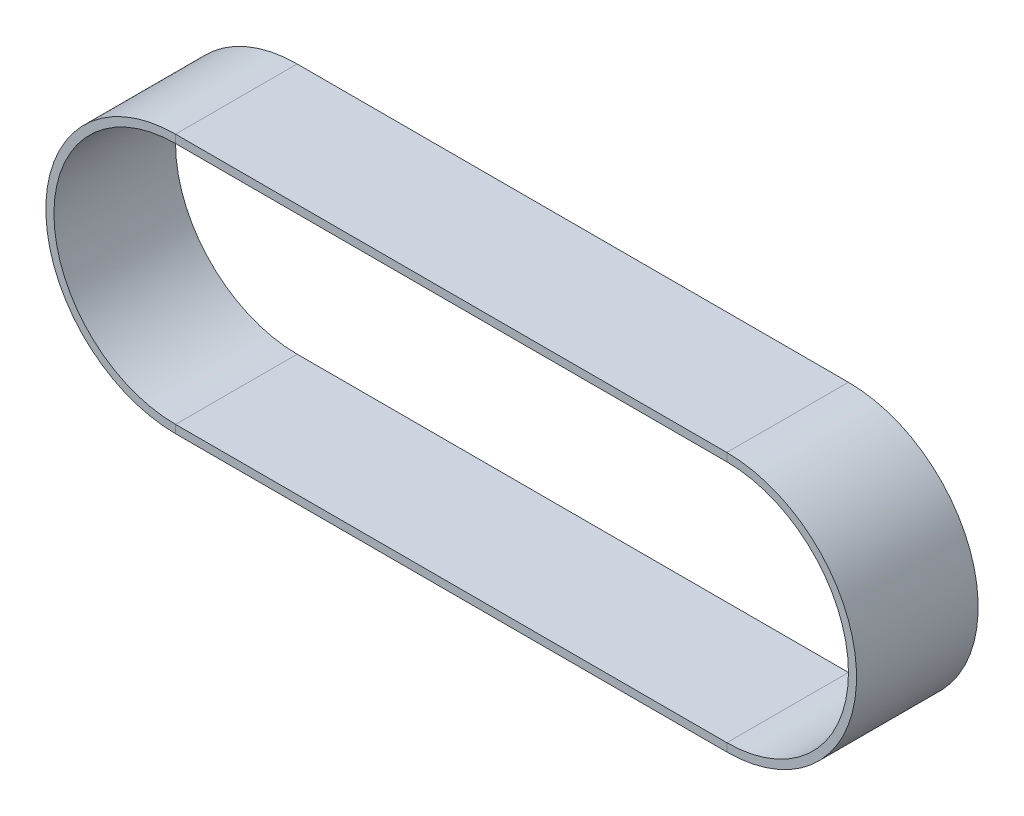
ISO-10303-21;
HEADER;
FILE_DESCRIPTION(('STEP AP214'),'2;1');
FILE_NAME('part.step','',(''),(''),'','','');
FILE_SCHEMA(('AUTOMOTIVE_DESIGN { 1 0 10303 214 1 1 1 1 }'));
ENDSEC;
DATA;
#1=APPLICATION_CONTEXT('core data for automotive mechanical design processes');
#2=APPLICATION_PROTOCOL_DEFINITION('international standard','automotive_design',2000,#1);
#3=PRODUCT_CONTEXT('',#1,'mechanical');
#4=PRODUCT('Part','Part','',(#3));
#5=PRODUCT_RELATED_PRODUCT_CATEGORY('part','',(#4));
#6=PRODUCT_DEFINITION_FORMATION('','',#4);
#7=PRODUCT_DEFINITION_CONTEXT('part definition',#1,'design');
#8=PRODUCT_DEFINITION('design','',#6,#7);
#9=PRODUCT_DEFINITION_SHAPE('','',#8);
#10=(LENGTH_UNIT() NAMED_UNIT(*) SI_UNIT(.MILLI.,.METRE.));
#11=(NAMED_UNIT(*) PLANE_ANGLE_UNIT() SI_UNIT($,.RADIAN.));
#12=(NAMED_UNIT(*) SI_UNIT($,.STERADIAN.) SOLID_ANGLE_UNIT());
#13=UNCERTAINTY_MEASURE_WITH_UNIT(LENGTH_MEASURE(1.E-05),#10,'distance_accuracy_value','');
#14=(GEOMETRIC_REPRESENTATION_CONTEXT(3) GLOBAL_UNCERTAINTY_ASSIGNED_CONTEXT((#13)) GLOBAL_UNIT_ASSIGNED_CONTEXT((#10,
#11,#12)) REPRESENTATION_CONTEXT('',''));
#15=CARTESIAN_POINT('',(0.,0.,0.));
#16=DIRECTION('',(0.,0.,1.));
#17=DIRECTION('',(1.,0.,0.));
#18=AXIS2_PLACEMENT_3D('',#15,#16,#17);
#19=CARTESIAN_POINT('',(-1358.,320.,-150.));
#20=DIRECTION('',(0.,0.,1.));
#21=DIRECTION('',(1.,0.,0.));
#22=AXIS2_PLACEMENT_3D('',#19,#20,#21);
#23=PLANE('',#22);
#24=DIRECTION('',(0.,-1.,0.));
#25=VECTOR('',#24,1.);
#26=CARTESIAN_POINT('',(-1358.,320.,-150.));
#27=LINE('',#26,#25);
#28=CARTESIAN_POINT('',(-1358.,320.,-150.));
#29=VERTEX_POINT('',#28);
#30=CARTESIAN_POINT('',(-1358.,300.,-150.));
#31=VERTEX_POINT('',#30);
#32=EDGE_CURVE('E151',#29,#31,#27,.T.);
#33=ORIENTED_EDGE('',*,*,#32,.F.);
#34=DIRECTION('',(1.,0.,0.));
#35=VECTOR('',#34,1.);
#36=CARTESIAN_POINT('',(-1358.,320.,-150.));
#37=LINE('',#36,#35);
#38=CARTESIAN_POINT('',(1.99999999999996,320.,-150.));
#39=VERTEX_POINT('',#38);
#40=EDGE_CURVE('E150',#29,#39,#37,.T.);
#41=ORIENTED_EDGE('',*,*,#40,.T.);
#42=DIRECTION('',(0.,-1.,0.));
#43=VECTOR('',#42,1.);
#44=CARTESIAN_POINT('',(1.99999999999996,320.,-150.));
#45=LINE('',#44,#43);
#46=CARTESIAN_POINT('',(1.99999999999998,300.,-150.));
#47=VERTEX_POINT('',#46);
#48=EDGE_CURVE('E129',#39,#47,#45,.T.);
#49=ORIENTED_EDGE('',*,*,#48,.T.);
#50=DIRECTION('',(1.,0.,0.));
#51=VECTOR('',#50,1.);
#52=CARTESIAN_POINT('',(-1358.,300.,-150.));
#53=LINE('',#52,#51);
#54=EDGE_CURVE('E155',#31,#47,#53,.T.);
#55=ORIENTED_EDGE('',*,*,#54,.F.);
#56=EDGE_LOOP('',(#33,#41,#49,#55));
#57=FACE_BOUND('',#56,.T.);
#58=ADVANCED_FACE('F35',(#57),#23,.F.);
#59=CARTESIAN_POINT('',(1.99999999999996,320.,-150.));
#60=DIRECTION('',(0.,0.,1.));
#61=DIRECTION('',(1.,0.,0.));
#62=AXIS2_PLACEMENT_3D('',#59,#60,#61);
#63=PLANE('',#62);
#64=CARTESIAN_POINT('',(2.,0.,-150.));
#65=DIRECTION('',(0.,0.,-1.));
#66=DIRECTION('',(0.,1.,0.));
#67=AXIS2_PLACEMENT_3D('',#64,#65,#66);
#68=CIRCLE('',#67,300.);
#69=CARTESIAN_POINT('',(2.00000000000006,-300.,-150.));
#70=VERTEX_POINT('',#69);
#71=EDGE_CURVE('E119',#47,#70,#68,.T.);
#72=ORIENTED_EDGE('',*,*,#71,.F.);
#73=ORIENTED_EDGE('',*,*,#48,.F.);
#74=CARTESIAN_POINT('',(2.,0.,-150.));
#75=DIRECTION('',(0.,0.,-1.));
#76=DIRECTION('',(0.,1.,0.));
#77=AXIS2_PLACEMENT_3D('',#74,#75,#76);
#78=CIRCLE('',#77,320.);
#79=CARTESIAN_POINT('',(2.00000000000008,-320.,-150.));
#80=VERTEX_POINT('',#79);
#81=EDGE_CURVE('E132',#39,#80,#78,.T.);
#82=ORIENTED_EDGE('',*,*,#81,.T.);
#83=DIRECTION('',(0.,1.,0.));
#84=VECTOR('',#83,1.);
#85=CARTESIAN_POINT('',(2.00000000000008,-320.,-150.));
#86=LINE('',#85,#84);
#87=EDGE_CURVE('E147',#80,#70,#86,.T.);
#88=ORIENTED_EDGE('',*,*,#87,.T.);
#89=EDGE_LOOP('',(#72,#73,#82,#88));
#90=FACE_BOUND('',#89,.T.);
#91=ADVANCED_FACE('F131',(#90),#63,.F.);
#92=CARTESIAN_POINT('',(2.,0.,0.));
#93=DIRECTION('',(0.,0.,-1.));
#94=DIRECTION('',(-1.,0.,0.));
#95=AXIS2_PLACEMENT_3D('',#92,#93,#94);
#96=CYLINDRICAL_SURFACE('',#95,300.);
#97=CARTESIAN_POINT('',(2.,0.,150.));
#98=DIRECTION('',(0.,0.,-1.));
#99=DIRECTION('',(0.,1.,0.));
#100=AXIS2_PLACEMENT_3D('',#97,#98,#99);
#101=CIRCLE('',#100,300.);
#102=CARTESIAN_POINT('',(2.,300.,150.));
#103=VERTEX_POINT('',#102);
#104=CARTESIAN_POINT('',(2.00000000000004,-300.,150.));
#105=VERTEX_POINT('',#104);
#106=EDGE_CURVE('E113',#103,#105,#101,.T.);
#107=ORIENTED_EDGE('',*,*,#106,.F.);
#108=DIRECTION('',(0.,0.,1.));
#109=VECTOR('',#108,1.);
#110=CARTESIAN_POINT('',(1.99999999999998,300.,-150.));
#111=LINE('',#110,#109);
#112=EDGE_CURVE('E137',#47,#103,#111,.T.);
#113=ORIENTED_EDGE('',*,*,#112,.F.);
#114=ORIENTED_EDGE('',*,*,#71,.T.);
#115=DIRECTION('',(0.,0.,1.));
#116=VECTOR('',#115,1.);
#117=CARTESIAN_POINT('',(2.00000000000006,-300.,-150.));
#118=LINE('',#117,#116);
#119=EDGE_CURVE('E195',#70,#105,#118,.T.);
#120=ORIENTED_EDGE('',*,*,#119,.T.);
#121=EDGE_LOOP('',(#107,#113,#114,#120));
#122=FACE_BOUND('',#121,.T.);
#123=ADVANCED_FACE('F214',(#122),#96,.F.);
#124=CARTESIAN_POINT('',(2.,320.,150.));
#125=DIRECTION('',(0.,0.,-1.));
#126=DIRECTION('',(-1.,0.,0.));
#127=AXIS2_PLACEMENT_3D('',#124,#125,#126);
#128=PLANE('',#127);
#129=CARTESIAN_POINT('',(2.,0.,150.));
#130=DIRECTION('',(0.,0.,-1.));
#131=DIRECTION('',(0.,1.,0.));
#132=AXIS2_PLACEMENT_3D('',#129,#130,#131);
#133=CIRCLE('',#132,320.);
#134=CARTESIAN_POINT('',(2.,320.,150.));
#135=VERTEX_POINT('',#134);
#136=CARTESIAN_POINT('',(2.00000000000004,-320.,150.));
#137=VERTEX_POINT('',#136);
#138=EDGE_CURVE('E165',#135,#137,#133,.T.);
#139=ORIENTED_EDGE('',*,*,#138,.F.);
#140=DIRECTION('',(0.,1.,0.));
#141=VECTOR('',#140,1.);
#142=CARTESIAN_POINT('',(2.,320.,150.));
#143=LINE('',#142,#141);
#144=EDGE_CURVE('E158',#103,#135,#143,.T.);
#145=ORIENTED_EDGE('',*,*,#144,.F.);
#146=ORIENTED_EDGE('',*,*,#106,.T.);
#147=DIRECTION('',(0.,-1.,0.));
#148=VECTOR('',#147,1.);
#149=CARTESIAN_POINT('',(2.00000000000004,-320.,150.));
#150=LINE('',#149,#148);
#151=EDGE_CURVE('E183',#105,#137,#150,.T.);
#152=ORIENTED_EDGE('',*,*,#151,.T.);
#153=EDGE_LOOP('',(#139,#145,#146,#152));
#154=FACE_BOUND('',#153,.T.);
#155=ADVANCED_FACE('F182',(#154),#128,.F.);
#156=CARTESIAN_POINT('',(2.,0.,0.));
#157=DIRECTION('',(0.,0.,-1.));
#158=DIRECTION('',(-1.,0.,0.));
#159=AXIS2_PLACEMENT_3D('',#156,#157,#158);
#160=CYLINDRICAL_SURFACE('',#159,320.);
#161=DIRECTION('',(0.,0.,-1.));
#162=VECTOR('',#161,1.);
#163=CARTESIAN_POINT('',(2.00000000000008,-320.,-150.));
#164=LINE('',#163,#162);
#165=EDGE_CURVE('E145',#137,#80,#164,.T.);
#166=ORIENTED_EDGE('',*,*,#165,.T.);
#167=ORIENTED_EDGE('',*,*,#81,.F.);
#168=DIRECTION('',(0.,0.,-1.));
#169=VECTOR('',#168,1.);
#170=CARTESIAN_POINT('',(1.99999999999996,320.,-150.));
#171=LINE('',#170,#169);
#172=EDGE_CURVE('E144',#135,#39,#171,.T.);
#173=ORIENTED_EDGE('',*,*,#172,.F.);
#174=ORIENTED_EDGE('',*,*,#138,.T.);
#175=EDGE_LOOP('',(#166,#167,#173,#174));
#176=FACE_BOUND('',#175,.T.);
#177=ADVANCED_FACE('F142',(#176),#160,.T.);
#178=CARTESIAN_POINT('',(2.00000000000002,-320.,-150.));
#179=DIRECTION('',(0.,0.,1.));
#180=DIRECTION('',(1.,0.,0.));
#181=AXIS2_PLACEMENT_3D('',#178,#179,#180);
#182=PLANE('',#181);
#183=DIRECTION('',(-1.,0.,0.));
#184=VECTOR('',#183,1.);
#185=CARTESIAN_POINT('',(2.,-300.,-150.));
#186=LINE('',#185,#184);
#187=CARTESIAN_POINT('',(-1358.,-300.,-150.));
#188=VERTEX_POINT('',#187);
#189=EDGE_CURVE('E100',#70,#188,#186,.T.);
#190=ORIENTED_EDGE('',*,*,#189,.F.);
#191=ORIENTED_EDGE('',*,*,#87,.F.);
#192=DIRECTION('',(-1.,0.,0.));
#193=VECTOR('',#192,1.);
#194=CARTESIAN_POINT('',(2.00000000000002,-320.,-150.));
#195=LINE('',#194,#193);
#196=CARTESIAN_POINT('',(-1358.,-320.,-150.));
#197=VERTEX_POINT('',#196);
#198=EDGE_CURVE('E164',#80,#197,#195,.T.);
#199=ORIENTED_EDGE('',*,*,#198,.T.);
#200=DIRECTION('',(0.,1.,0.));
#201=VECTOR('',#200,1.);
#202=CARTESIAN_POINT('',(-1358.,-320.,-150.));
#203=LINE('',#202,#201);
#204=EDGE_CURVE('E205',#197,#188,#203,.T.);
#205=ORIENTED_EDGE('',*,*,#204,.T.);
#206=EDGE_LOOP('',(#190,#191,#199,#205));
#207=FACE_BOUND('',#206,.T.);
#208=ADVANCED_FACE('F210',(#207),#182,.F.);
#209=CARTESIAN_POINT('',(2.,-300.,-150.));
#210=DIRECTION('',(0.,-1.,0.));
#211=DIRECTION('',(0.,0.,-1.));
#212=AXIS2_PLACEMENT_3D('',#209,#210,#211);
#213=PLANE('',#212);
#214=DIRECTION('',(-1.,0.,0.));
#215=VECTOR('',#214,1.);
#216=CARTESIAN_POINT('',(1.99999999999998,-300.,150.));
#217=LINE('',#216,#215);
#218=CARTESIAN_POINT('',(-1358.,-300.,150.));
#219=VERTEX_POINT('',#218);
#220=EDGE_CURVE('E93',#105,#219,#217,.T.);
#221=ORIENTED_EDGE('',*,*,#220,.F.);
#222=ORIENTED_EDGE('',*,*,#119,.F.);
#223=ORIENTED_EDGE('',*,*,#189,.T.);
#224=DIRECTION('',(0.,0.,1.));
#225=VECTOR('',#224,1.);
#226=CARTESIAN_POINT('',(-1358.,-300.,-150.));
#227=LINE('',#226,#225);
#228=EDGE_CURVE('E192',#188,#219,#227,.T.);
#229=ORIENTED_EDGE('',*,*,#228,.T.);
#230=EDGE_LOOP('',(#221,#222,#223,#229));
#231=FACE_BOUND('',#230,.T.);
#232=ADVANCED_FACE('F213',(#231),#213,.F.);
#233=CARTESIAN_POINT('',(1.99999999999998,-320.,150.));
#234=DIRECTION('',(0.,0.,-1.));
#235=DIRECTION('',(-1.,0.,0.));
#236=AXIS2_PLACEMENT_3D('',#233,#234,#235);
#237=PLANE('',#236);
#238=DIRECTION('',(-1.,0.,0.));
#239=VECTOR('',#238,1.);
#240=CARTESIAN_POINT('',(1.99999999999998,-320.,150.));
#241=LINE('',#240,#239);
#242=CARTESIAN_POINT('',(-1358.,-320.,150.));
#243=VERTEX_POINT('',#242);
#244=EDGE_CURVE('E84',#137,#243,#241,.T.);
#245=ORIENTED_EDGE('',*,*,#244,.F.);
#246=ORIENTED_EDGE('',*,*,#151,.F.);
#247=ORIENTED_EDGE('',*,*,#220,.T.);
#248=DIRECTION('',(0.,-1.,0.));
#249=VECTOR('',#248,1.);
#250=CARTESIAN_POINT('',(-1358.,-320.,150.));
#251=LINE('',#250,#249);
#252=EDGE_CURVE('E170',#219,#243,#251,.T.);
#253=ORIENTED_EDGE('',*,*,#252,.T.);
#254=EDGE_LOOP('',(#245,#246,#247,#253));
#255=FACE_BOUND('',#254,.T.);
#256=ADVANCED_FACE('F232',(#255),#237,.F.);
#257=CARTESIAN_POINT('',(2.00000000000002,-320.,-150.));
#258=DIRECTION('',(0.,1.,0.));
#259=DIRECTION('',(0.,0.,1.));
#260=AXIS2_PLACEMENT_3D('',#257,#258,#259);
#261=PLANE('',#260);
#262=DIRECTION('',(0.,0.,-1.));
#263=VECTOR('',#262,1.);
#264=CARTESIAN_POINT('',(-1358.,-320.,-150.));
#265=LINE('',#264,#263);
#266=EDGE_CURVE('E166',#243,#197,#265,.T.);
#267=ORIENTED_EDGE('',*,*,#266,.T.);
#268=ORIENTED_EDGE('',*,*,#198,.F.);
#269=ORIENTED_EDGE('',*,*,#165,.F.);
#270=ORIENTED_EDGE('',*,*,#244,.T.);
#271=EDGE_LOOP('',(#267,#268,#269,#270));
#272=FACE_BOUND('',#271,.T.);
#273=ADVANCED_FACE('F224',(#272),#261,.F.);
#274=CARTESIAN_POINT('',(-1358.,-320.,-150.));
#275=DIRECTION('',(0.,0.,1.));
#276=DIRECTION('',(1.,0.,0.));
#277=AXIS2_PLACEMENT_3D('',#274,#275,#276);
#278=PLANE('',#277);
#279=CARTESIAN_POINT('',(-1358.,0.,-150.));
#280=DIRECTION('',(0.,0.,-1.));
#281=DIRECTION('',(0.,-1.,0.));
#282=AXIS2_PLACEMENT_3D('',#279,#280,#281);
#283=CIRCLE('',#282,300.);
#284=EDGE_CURVE('E190',#188,#31,#283,.T.);
#285=ORIENTED_EDGE('',*,*,#284,.F.);
#286=ORIENTED_EDGE('',*,*,#204,.F.);
#287=CARTESIAN_POINT('',(-1358.,0.,-150.));
#288=DIRECTION('',(0.,0.,-1.));
#289=DIRECTION('',(0.,-1.,0.));
#290=AXIS2_PLACEMENT_3D('',#287,#288,#289);
#291=CIRCLE('',#290,320.);
#292=EDGE_CURVE('E167',#197,#29,#291,.T.);
#293=ORIENTED_EDGE('',*,*,#292,.T.);
#294=ORIENTED_EDGE('',*,*,#32,.T.);
#295=EDGE_LOOP('',(#285,#286,#293,#294));
#296=FACE_BOUND('',#295,.T.);
#297=ADVANCED_FACE('F222',(#296),#278,.F.);
#298=CARTESIAN_POINT('',(-1358.,0.,0.));
#299=DIRECTION('',(0.,0.,-1.));
#300=DIRECTION('',(-1.,0.,0.));
#301=AXIS2_PLACEMENT_3D('',#298,#299,#300);
#302=CYLINDRICAL_SURFACE('',#301,300.);
#303=CARTESIAN_POINT('',(-1358.,0.,150.));
#304=DIRECTION('',(0.,0.,-1.));
#305=DIRECTION('',(0.,-1.,0.));
#306=AXIS2_PLACEMENT_3D('',#303,#304,#305);
#307=CIRCLE('',#306,300.);
#308=CARTESIAN_POINT('',(-1358.,300.,150.));
#309=VERTEX_POINT('',#308);
#310=EDGE_CURVE('E60',#219,#309,#307,.T.);
#311=ORIENTED_EDGE('',*,*,#310,.F.);
#312=ORIENTED_EDGE('',*,*,#228,.F.);
#313=ORIENTED_EDGE('',*,*,#284,.T.);
#314=DIRECTION('',(0.,0.,1.));
#315=VECTOR('',#314,1.);
#316=CARTESIAN_POINT('',(-1358.,300.,-150.));
#317=LINE('',#316,#315);
#318=EDGE_CURVE('E188',#31,#309,#317,.T.);
#319=ORIENTED_EDGE('',*,*,#318,.T.);
#320=EDGE_LOOP('',(#311,#312,#313,#319));
#321=FACE_BOUND('',#320,.T.);
#322=ADVANCED_FACE('F219',(#321),#302,.F.);
#323=CARTESIAN_POINT('',(-1358.,-320.,150.));
#324=DIRECTION('',(0.,0.,-1.));
#325=DIRECTION('',(-1.,0.,0.));
#326=AXIS2_PLACEMENT_3D('',#323,#324,#325);
#327=PLANE('',#326);
#328=CARTESIAN_POINT('',(-1358.,0.,150.));
#329=DIRECTION('',(0.,0.,-1.));
#330=DIRECTION('',(0.,-1.,0.));
#331=AXIS2_PLACEMENT_3D('',#328,#329,#330);
#332=CIRCLE('',#331,320.);
#333=CARTESIAN_POINT('',(-1358.,320.,150.));
#334=VERTEX_POINT('',#333);
#335=EDGE_CURVE('E52',#243,#334,#332,.T.);
#336=ORIENTED_EDGE('',*,*,#335,.F.);
#337=ORIENTED_EDGE('',*,*,#252,.F.);
#338=ORIENTED_EDGE('',*,*,#310,.T.);
#339=DIRECTION('',(0.,1.,0.));
#340=VECTOR('',#339,1.);
#341=CARTESIAN_POINT('',(-1358.,320.,150.));
#342=LINE('',#341,#340);
#343=EDGE_CURVE('E175',#309,#334,#342,.T.);
#344=ORIENTED_EDGE('',*,*,#343,.T.);
#345=EDGE_LOOP('',(#336,#337,#338,#344));
#346=FACE_BOUND('',#345,.T.);
#347=ADVANCED_FACE('F230',(#346),#327,.F.);
#348=CARTESIAN_POINT('',(-1358.,0.,0.));
#349=DIRECTION('',(0.,0.,-1.));
#350=DIRECTION('',(-1.,0.,0.));
#351=AXIS2_PLACEMENT_3D('',#348,#349,#350);
#352=CYLINDRICAL_SURFACE('',#351,320.);
#353=DIRECTION('',(0.,0.,-1.));
#354=VECTOR('',#353,1.);
#355=CARTESIAN_POINT('',(-1358.,320.,-150.));
#356=LINE('',#355,#354);
#357=EDGE_CURVE('E39',#334,#29,#356,.T.);
#358=ORIENTED_EDGE('',*,*,#357,.T.);
#359=ORIENTED_EDGE('',*,*,#292,.F.);
#360=ORIENTED_EDGE('',*,*,#266,.F.);
#361=ORIENTED_EDGE('',*,*,#335,.T.);
#362=EDGE_LOOP('',(#358,#359,#360,#361));
#363=FACE_BOUND('',#362,.T.);
#364=ADVANCED_FACE('F176',(#363),#352,.T.);
#365=CARTESIAN_POINT('',(-1358.,300.,-150.));
#366=DIRECTION('',(0.,1.,0.));
#367=DIRECTION('',(0.,0.,1.));
#368=AXIS2_PLACEMENT_3D('',#365,#366,#367);
#369=PLANE('',#368);
#370=ORIENTED_EDGE('',*,*,#54,.T.);
#371=ORIENTED_EDGE('',*,*,#112,.T.);
#372=DIRECTION('',(1.,0.,0.));
#373=VECTOR('',#372,1.);
#374=CARTESIAN_POINT('',(-1358.,300.,150.));
#375=LINE('',#374,#373);
#376=EDGE_CURVE('E44',#309,#103,#375,.T.);
#377=ORIENTED_EDGE('',*,*,#376,.F.);
#378=ORIENTED_EDGE('',*,*,#318,.F.);
#379=EDGE_LOOP('',(#370,#371,#377,#378));
#380=FACE_BOUND('',#379,.T.);
#381=ADVANCED_FACE('F216',(#380),#369,.F.);
#382=CARTESIAN_POINT('',(-1358.,320.,150.));
#383=DIRECTION('',(0.,0.,-1.));
#384=DIRECTION('',(-1.,0.,0.));
#385=AXIS2_PLACEMENT_3D('',#382,#383,#384);
#386=PLANE('',#385);
#387=ORIENTED_EDGE('',*,*,#376,.T.);
#388=ORIENTED_EDGE('',*,*,#144,.T.);
#389=DIRECTION('',(1.,0.,0.));
#390=VECTOR('',#389,1.);
#391=CARTESIAN_POINT('',(-1358.,320.,150.));
#392=LINE('',#391,#390);
#393=EDGE_CURVE('E11',#334,#135,#392,.T.);
#394=ORIENTED_EDGE('',*,*,#393,.F.);
#395=ORIENTED_EDGE('',*,*,#343,.F.);
#396=EDGE_LOOP('',(#387,#388,#394,#395));
#397=FACE_BOUND('',#396,.T.);
#398=ADVANCED_FACE('F180',(#397),#386,.F.);
#399=CARTESIAN_POINT('',(-1358.,320.,-150.));
#400=DIRECTION('',(0.,-1.,0.));
#401=DIRECTION('',(0.,0.,-1.));
#402=AXIS2_PLACEMENT_3D('',#399,#400,#401);
#403=PLANE('',#402);
#404=ORIENTED_EDGE('',*,*,#393,.T.);
#405=ORIENTED_EDGE('',*,*,#172,.T.);
#406=ORIENTED_EDGE('',*,*,#40,.F.);
#407=ORIENTED_EDGE('',*,*,#357,.F.);
#408=EDGE_LOOP('',(#404,#405,#406,#407));
#409=FACE_BOUND('',#408,.T.);
#410=ADVANCED_FACE('F37',(#409),#403,.F.);
#411=CLOSED_SHELL('',(#58,#91,#123,#155,#177,#208,#232,#256,#273,#297,#322,#347,#364,#381,#398,#410));
#412=MANIFOLD_SOLID_BREP('B2',#411);
#413=ADVANCED_BREP_SHAPE_REPRESENTATION('',(#18,#412),#14);
#414=SHAPE_DEFINITION_REPRESENTATION(#9,#413);
ENDSEC;
END-ISO-10303-21;
